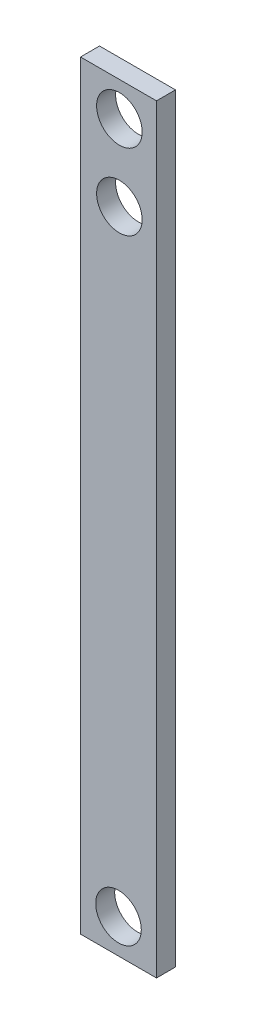
ISO-10303-21;
HEADER;
FILE_DESCRIPTION(('STEP AP214'),'2;1');
FILE_NAME('part.step','',(''),(''),'','','');
FILE_SCHEMA(('AUTOMOTIVE_DESIGN { 1 0 10303 214 1 1 1 1 }'));
ENDSEC;
DATA;
#1=APPLICATION_CONTEXT('core data for automotive mechanical design processes');
#2=APPLICATION_PROTOCOL_DEFINITION('international standard','automotive_design',2000,#1);
#3=PRODUCT_CONTEXT('',#1,'mechanical');
#4=PRODUCT('Part','Part','',(#3));
#5=PRODUCT_RELATED_PRODUCT_CATEGORY('part','',(#4));
#6=PRODUCT_DEFINITION_FORMATION('','',#4);
#7=PRODUCT_DEFINITION_CONTEXT('part definition',#1,'design');
#8=PRODUCT_DEFINITION('design','',#6,#7);
#9=PRODUCT_DEFINITION_SHAPE('','',#8);
#10=(LENGTH_UNIT() NAMED_UNIT(*) SI_UNIT(.MILLI.,.METRE.));
#11=(NAMED_UNIT(*) PLANE_ANGLE_UNIT() SI_UNIT($,.RADIAN.));
#12=(NAMED_UNIT(*) SI_UNIT($,.STERADIAN.) SOLID_ANGLE_UNIT());
#13=UNCERTAINTY_MEASURE_WITH_UNIT(LENGTH_MEASURE(1.E-05),#10,'distance_accuracy_value','');
#14=(GEOMETRIC_REPRESENTATION_CONTEXT(3) GLOBAL_UNCERTAINTY_ASSIGNED_CONTEXT((#13)) GLOBAL_UNIT_ASSIGNED_CONTEXT((#10,
#11,#12)) REPRESENTATION_CONTEXT('',''));
#15=CARTESIAN_POINT('',(0.,0.,0.));
#16=DIRECTION('',(0.,0.,1.));
#17=DIRECTION('',(1.,0.,0.));
#18=AXIS2_PLACEMENT_3D('',#15,#16,#17);
#19=CARTESIAN_POINT('',(0.,0.,2.5));
#20=DIRECTION('',(0.,1.,0.));
#21=DIRECTION('',(0.,0.,1.));
#22=AXIS2_PLACEMENT_3D('',#19,#20,#21);
#23=PLANE('',#22);
#24=DIRECTION('',(1.,0.,0.));
#25=VECTOR('',#24,1.);
#26=CARTESIAN_POINT('',(0.,0.,0.));
#27=LINE('',#26,#25);
#28=CARTESIAN_POINT('',(0.,0.,0.));
#29=VERTEX_POINT('',#28);
#30=CARTESIAN_POINT('',(10.,0.,0.));
#31=VERTEX_POINT('',#30);
#32=EDGE_CURVE('E108',#29,#31,#27,.T.);
#33=ORIENTED_EDGE('',*,*,#32,.T.);
#34=DIRECTION('',(0.,0.,-1.));
#35=VECTOR('',#34,1.);
#36=CARTESIAN_POINT('',(10.,0.,2.5));
#37=LINE('',#36,#35);
#38=CARTESIAN_POINT('',(10.,0.,2.5));
#39=VERTEX_POINT('',#38);
#40=EDGE_CURVE('E11',#39,#31,#37,.T.);
#41=ORIENTED_EDGE('',*,*,#40,.F.);
#42=DIRECTION('',(1.,0.,0.));
#43=VECTOR('',#42,1.);
#44=CARTESIAN_POINT('',(0.,0.,2.5));
#45=LINE('',#44,#43);
#46=CARTESIAN_POINT('',(0.,0.,2.5));
#47=VERTEX_POINT('',#46);
#48=EDGE_CURVE('E89',#47,#39,#45,.T.);
#49=ORIENTED_EDGE('',*,*,#48,.F.);
#50=DIRECTION('',(0.,0.,-1.));
#51=VECTOR('',#50,1.);
#52=CARTESIAN_POINT('',(0.,0.,2.5));
#53=LINE('',#52,#51);
#54=EDGE_CURVE('E56',#47,#29,#53,.T.);
#55=ORIENTED_EDGE('',*,*,#54,.T.);
#56=EDGE_LOOP('',(#33,#41,#49,#55));
#57=FACE_BOUND('',#56,.T.);
#58=ADVANCED_FACE('F38',(#57),#23,.F.);
#59=CARTESIAN_POINT('',(10.,0.,2.5));
#60=DIRECTION('',(-1.,0.,0.));
#61=DIRECTION('',(0.,0.,1.));
#62=AXIS2_PLACEMENT_3D('',#59,#60,#61);
#63=PLANE('',#62);
#64=DIRECTION('',(0.,1.,0.));
#65=VECTOR('',#64,1.);
#66=CARTESIAN_POINT('',(10.,0.,0.));
#67=LINE('',#66,#65);
#68=CARTESIAN_POINT('',(10.,100.,0.));
#69=VERTEX_POINT('',#68);
#70=EDGE_CURVE('E95',#31,#69,#67,.T.);
#71=ORIENTED_EDGE('',*,*,#70,.T.);
#72=DIRECTION('',(0.,0.,-1.));
#73=VECTOR('',#72,1.);
#74=CARTESIAN_POINT('',(10.,100.,2.5));
#75=LINE('',#74,#73);
#76=CARTESIAN_POINT('',(10.,100.,2.5));
#77=VERTEX_POINT('',#76);
#78=EDGE_CURVE('E48',#77,#69,#75,.T.);
#79=ORIENTED_EDGE('',*,*,#78,.F.);
#80=DIRECTION('',(0.,1.,0.));
#81=VECTOR('',#80,1.);
#82=CARTESIAN_POINT('',(10.,0.,2.5));
#83=LINE('',#82,#81);
#84=EDGE_CURVE('E81',#39,#77,#83,.T.);
#85=ORIENTED_EDGE('',*,*,#84,.F.);
#86=ORIENTED_EDGE('',*,*,#40,.T.);
#87=EDGE_LOOP('',(#71,#79,#85,#86));
#88=FACE_BOUND('',#87,.T.);
#89=ADVANCED_FACE('F94',(#88),#63,.F.);
#90=CARTESIAN_POINT('',(0.,100.,2.5));
#91=DIRECTION('',(0.,1.,0.));
#92=DIRECTION('',(0.,0.,1.));
#93=AXIS2_PLACEMENT_3D('',#90,#91,#92);
#94=PLANE('',#93);
#95=DIRECTION('',(1.,0.,0.));
#96=VECTOR('',#95,1.);
#97=CARTESIAN_POINT('',(0.,100.,0.));
#98=LINE('',#97,#96);
#99=CARTESIAN_POINT('',(0.,100.,0.));
#100=VERTEX_POINT('',#99);
#101=EDGE_CURVE('E114',#100,#69,#98,.T.);
#102=ORIENTED_EDGE('',*,*,#101,.F.);
#103=DIRECTION('',(0.,0.,-1.));
#104=VECTOR('',#103,1.);
#105=CARTESIAN_POINT('',(0.,100.,2.5));
#106=LINE('',#105,#104);
#107=CARTESIAN_POINT('',(0.,100.,2.5));
#108=VERTEX_POINT('',#107);
#109=EDGE_CURVE('E70',#108,#100,#106,.T.);
#110=ORIENTED_EDGE('',*,*,#109,.F.);
#111=DIRECTION('',(1.,0.,0.));
#112=VECTOR('',#111,1.);
#113=CARTESIAN_POINT('',(0.,100.,2.5));
#114=LINE('',#113,#112);
#115=EDGE_CURVE('E88',#108,#77,#114,.T.);
#116=ORIENTED_EDGE('',*,*,#115,.T.);
#117=ORIENTED_EDGE('',*,*,#78,.T.);
#118=EDGE_LOOP('',(#102,#110,#116,#117));
#119=FACE_BOUND('',#118,.T.);
#120=ADVANCED_FACE('F100',(#119),#94,.T.);
#121=CARTESIAN_POINT('',(0.,0.,2.5));
#122=DIRECTION('',(-1.,0.,0.));
#123=DIRECTION('',(0.,0.,1.));
#124=AXIS2_PLACEMENT_3D('',#121,#122,#123);
#125=PLANE('',#124);
#126=DIRECTION('',(0.,1.,0.));
#127=VECTOR('',#126,1.);
#128=CARTESIAN_POINT('',(0.,0.,0.));
#129=LINE('',#128,#127);
#130=EDGE_CURVE('E117',#29,#100,#129,.T.);
#131=ORIENTED_EDGE('',*,*,#130,.F.);
#132=ORIENTED_EDGE('',*,*,#54,.F.);
#133=DIRECTION('',(0.,1.,0.));
#134=VECTOR('',#133,1.);
#135=CARTESIAN_POINT('',(0.,0.,2.5));
#136=LINE('',#135,#134);
#137=EDGE_CURVE('E102',#47,#108,#136,.T.);
#138=ORIENTED_EDGE('',*,*,#137,.T.);
#139=ORIENTED_EDGE('',*,*,#109,.T.);
#140=EDGE_LOOP('',(#131,#132,#138,#139));
#141=FACE_BOUND('',#140,.T.);
#142=ADVANCED_FACE('F168',(#141),#125,.T.);
#143=CARTESIAN_POINT('',(0.,0.,2.5));
#144=DIRECTION('',(0.,0.,1.));
#145=DIRECTION('',(1.,0.,0.));
#146=AXIS2_PLACEMENT_3D('',#143,#144,#145);
#147=PLANE('',#146);
#148=CARTESIAN_POINT('',(5.11504841582118,95.5,2.5));
#149=DIRECTION('',(0.,0.,1.));
#150=DIRECTION('',(1.,0.,0.));
#151=AXIS2_PLACEMENT_3D('',#148,#149,#150);
#152=CIRCLE('',#151,3.);
#153=CARTESIAN_POINT('',(8.11504841582118,95.5,2.5));
#154=VERTEX_POINT('',#153);
#155=EDGE_CURVE('E142',#154,#154,#152,.T.);
#156=ORIENTED_EDGE('',*,*,#155,.F.);
#157=EDGE_LOOP('',(#156));
#158=FACE_BOUND('',#157,.T.);
#159=CARTESIAN_POINT('',(5.11504841582118,85.5,2.5));
#160=DIRECTION('',(0.,0.,1.));
#161=DIRECTION('',(1.,0.,0.));
#162=AXIS2_PLACEMENT_3D('',#159,#160,#161);
#163=CIRCLE('',#162,3.);
#164=CARTESIAN_POINT('',(8.11504841582118,85.5,2.5));
#165=VERTEX_POINT('',#164);
#166=EDGE_CURVE('E135',#165,#165,#163,.T.);
#167=ORIENTED_EDGE('',*,*,#166,.F.);
#168=EDGE_LOOP('',(#167));
#169=FACE_BOUND('',#168,.T.);
#170=CARTESIAN_POINT('',(5.,4.5,2.5));
#171=DIRECTION('',(0.,0.,1.));
#172=DIRECTION('',(1.,0.,0.));
#173=AXIS2_PLACEMENT_3D('',#170,#171,#172);
#174=CIRCLE('',#173,3.);
#175=CARTESIAN_POINT('',(8.,4.5,2.5));
#176=VERTEX_POINT('',#175);
#177=EDGE_CURVE('E127',#176,#176,#174,.T.);
#178=ORIENTED_EDGE('',*,*,#177,.F.);
#179=EDGE_LOOP('',(#178));
#180=FACE_BOUND('',#179,.T.);
#181=ORIENTED_EDGE('',*,*,#48,.T.);
#182=ORIENTED_EDGE('',*,*,#84,.T.);
#183=ORIENTED_EDGE('',*,*,#115,.F.);
#184=ORIENTED_EDGE('',*,*,#137,.F.);
#185=EDGE_LOOP('',(#181,#182,#183,#184));
#186=FACE_BOUND('',#185,.T.);
#187=ADVANCED_FACE('F85',(#158,#169,#180,#186),#147,.T.);
#188=CARTESIAN_POINT('',(0.,0.,0.));
#189=DIRECTION('',(0.,0.,1.));
#190=DIRECTION('',(1.,0.,0.));
#191=AXIS2_PLACEMENT_3D('',#188,#189,#190);
#192=PLANE('',#191);
#193=CARTESIAN_POINT('',(5.11504841582118,95.5,0.));
#194=DIRECTION('',(0.,0.,1.));
#195=DIRECTION('',(1.,0.,0.));
#196=AXIS2_PLACEMENT_3D('',#193,#194,#195);
#197=CIRCLE('',#196,3.);
#198=CARTESIAN_POINT('',(8.11504841582118,95.5,0.));
#199=VERTEX_POINT('',#198);
#200=EDGE_CURVE('E41',#199,#199,#197,.T.);
#201=ORIENTED_EDGE('',*,*,#200,.T.);
#202=EDGE_LOOP('',(#201));
#203=FACE_BOUND('',#202,.T.);
#204=CARTESIAN_POINT('',(5.11504841582118,85.5,0.));
#205=DIRECTION('',(0.,0.,1.));
#206=DIRECTION('',(1.,0.,0.));
#207=AXIS2_PLACEMENT_3D('',#204,#205,#206);
#208=CIRCLE('',#207,3.);
#209=CARTESIAN_POINT('',(8.11504841582118,85.5,0.));
#210=VERTEX_POINT('',#209);
#211=EDGE_CURVE('E131',#210,#210,#208,.T.);
#212=ORIENTED_EDGE('',*,*,#211,.T.);
#213=EDGE_LOOP('',(#212));
#214=FACE_BOUND('',#213,.T.);
#215=CARTESIAN_POINT('',(5.,4.5,0.));
#216=DIRECTION('',(0.,0.,1.));
#217=DIRECTION('',(1.,0.,0.));
#218=AXIS2_PLACEMENT_3D('',#215,#216,#217);
#219=CIRCLE('',#218,3.);
#220=CARTESIAN_POINT('',(8.,4.5,0.));
#221=VERTEX_POINT('',#220);
#222=EDGE_CURVE('E111',#221,#221,#219,.T.);
#223=ORIENTED_EDGE('',*,*,#222,.T.);
#224=EDGE_LOOP('',(#223));
#225=FACE_BOUND('',#224,.T.);
#226=ORIENTED_EDGE('',*,*,#32,.F.);
#227=ORIENTED_EDGE('',*,*,#130,.T.);
#228=ORIENTED_EDGE('',*,*,#101,.T.);
#229=ORIENTED_EDGE('',*,*,#70,.F.);
#230=EDGE_LOOP('',(#226,#227,#228,#229));
#231=FACE_BOUND('',#230,.T.);
#232=ADVANCED_FACE('F151',(#203,#214,#225,#231),#192,.F.);
#233=CARTESIAN_POINT('',(5.,4.5,0.));
#234=DIRECTION('',(0.,0.,1.));
#235=DIRECTION('',(1.,0.,0.));
#236=AXIS2_PLACEMENT_3D('',#233,#234,#235);
#237=CYLINDRICAL_SURFACE('',#236,3.);
#238=ORIENTED_EDGE('',*,*,#222,.F.);
#239=EDGE_LOOP('',(#238));
#240=FACE_BOUND('',#239,.T.);
#241=ORIENTED_EDGE('',*,*,#177,.T.);
#242=EDGE_LOOP('',(#241));
#243=FACE_BOUND('',#242,.T.);
#244=ADVANCED_FACE('F161',(#240,#243),#237,.F.);
#245=CARTESIAN_POINT('',(5.11504841582118,85.5,0.));
#246=DIRECTION('',(0.,0.,1.));
#247=DIRECTION('',(1.,0.,0.));
#248=AXIS2_PLACEMENT_3D('',#245,#246,#247);
#249=CYLINDRICAL_SURFACE('',#248,3.);
#250=ORIENTED_EDGE('',*,*,#211,.F.);
#251=EDGE_LOOP('',(#250));
#252=FACE_BOUND('',#251,.T.);
#253=ORIENTED_EDGE('',*,*,#166,.T.);
#254=EDGE_LOOP('',(#253));
#255=FACE_BOUND('',#254,.T.);
#256=ADVANCED_FACE('F156',(#252,#255),#249,.F.);
#257=CARTESIAN_POINT('',(5.11504841582118,95.5,-7.5));
#258=DIRECTION('',(0.,0.,1.));
#259=DIRECTION('',(1.,0.,0.));
#260=AXIS2_PLACEMENT_3D('',#257,#258,#259);
#261=CYLINDRICAL_SURFACE('',#260,3.);
#262=ORIENTED_EDGE('',*,*,#155,.T.);
#263=EDGE_LOOP('',(#262));
#264=FACE_BOUND('',#263,.T.);
#265=ORIENTED_EDGE('',*,*,#200,.F.);
#266=EDGE_LOOP('',(#265));
#267=FACE_BOUND('',#266,.T.);
#268=ADVANCED_FACE('F154',(#264,#267),#261,.F.);
#269=CLOSED_SHELL('',(#58,#89,#120,#142,#187,#232,#244,#256,#268));
#270=MANIFOLD_SOLID_BREP('B2',#269);
#271=ADVANCED_BREP_SHAPE_REPRESENTATION('',(#18,#270),#14);
#272=SHAPE_DEFINITION_REPRESENTATION(#9,#271);
ENDSEC;
END-ISO-10303-21;
